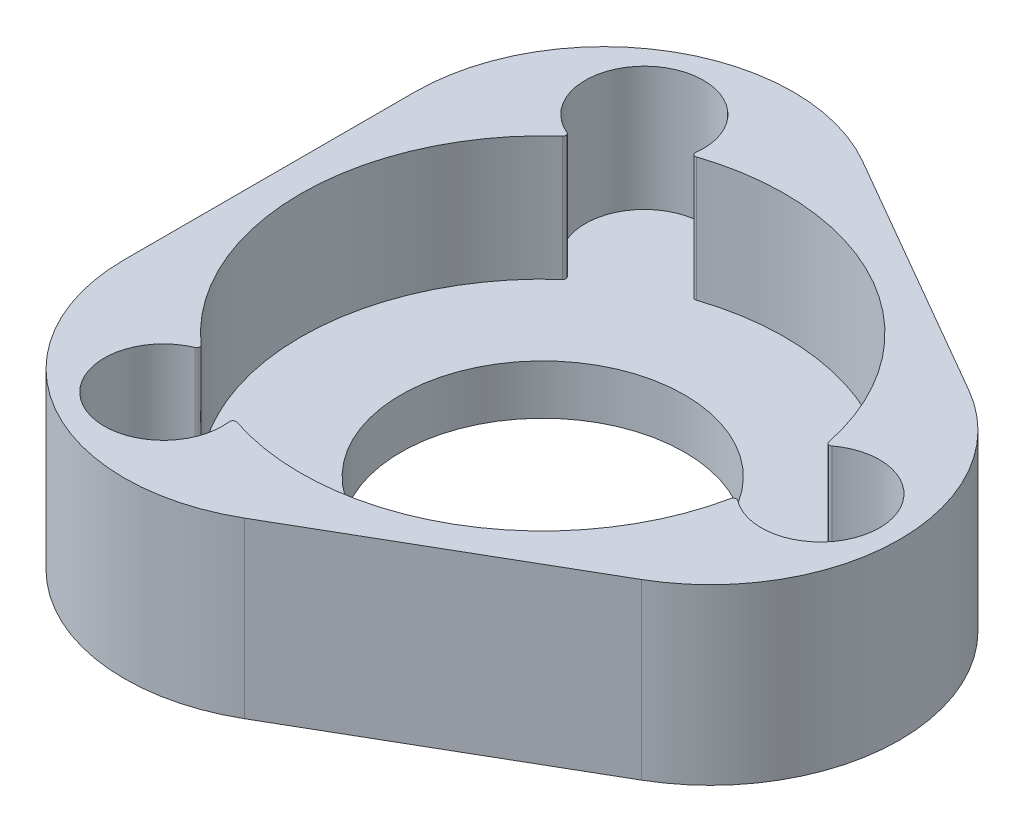
ISO-10303-21;
HEADER;
FILE_DESCRIPTION(('STEP AP214'),'2;1');
FILE_NAME('part.step','',(''),(''),'','','');
FILE_SCHEMA(('AUTOMOTIVE_DESIGN { 1 0 10303 214 1 1 1 1 }'));
ENDSEC;
DATA;
#1=APPLICATION_CONTEXT('core data for automotive mechanical design processes');
#2=APPLICATION_PROTOCOL_DEFINITION('international standard','automotive_design',2000,#1);
#3=PRODUCT_CONTEXT('',#1,'mechanical');
#4=PRODUCT('Part','Part','',(#3));
#5=PRODUCT_RELATED_PRODUCT_CATEGORY('part','',(#4));
#6=PRODUCT_DEFINITION_FORMATION('','',#4);
#7=PRODUCT_DEFINITION_CONTEXT('part definition',#1,'design');
#8=PRODUCT_DEFINITION('design','',#6,#7);
#9=PRODUCT_DEFINITION_SHAPE('','',#8);
#10=(LENGTH_UNIT() NAMED_UNIT(*) SI_UNIT(.MILLI.,.METRE.));
#11=(NAMED_UNIT(*) PLANE_ANGLE_UNIT() SI_UNIT($,.RADIAN.));
#12=(NAMED_UNIT(*) SI_UNIT($,.STERADIAN.) SOLID_ANGLE_UNIT());
#13=UNCERTAINTY_MEASURE_WITH_UNIT(LENGTH_MEASURE(1.E-05),#10,'distance_accuracy_value','');
#14=(GEOMETRIC_REPRESENTATION_CONTEXT(3) GLOBAL_UNCERTAINTY_ASSIGNED_CONTEXT((#13)) GLOBAL_UNIT_ASSIGNED_CONTEXT((#10,
#11,#12)) REPRESENTATION_CONTEXT('',''));
#15=CARTESIAN_POINT('',(0.,0.,0.));
#16=DIRECTION('',(0.,0.,1.));
#17=DIRECTION('',(1.,0.,0.));
#18=AXIS2_PLACEMENT_3D('',#15,#16,#17);
#19=CARTESIAN_POINT('',(-3.38,7.,-5.85433172958281));
#20=DIRECTION('',(0.,1.,0.));
#21=DIRECTION('',(0.,0.,1.));
#22=AXIS2_PLACEMENT_3D('',#19,#20,#21);
#23=PLANE('',#22);
#24=CARTESIAN_POINT('',(-3.38,7.,-5.85433172958281));
#25=DIRECTION('',(0.,1.,0.));
#26=DIRECTION('',(0.,0.,1.));
#27=AXIS2_PLACEMENT_3D('',#24,#25,#26);
#28=CIRCLE('',#27,7.62);
#29=CARTESIAN_POINT('',(0.43,7.,-12.4534453064202));
#30=VERTEX_POINT('',#29);
#31=CARTESIAN_POINT('',(-11.,7.,-5.85433172958281));
#32=VERTEX_POINT('',#31);
#33=EDGE_CURVE('E152',#30,#32,#28,.T.);
#34=ORIENTED_EDGE('',*,*,#33,.T.);
#35=DIRECTION('',(0.,0.,1.));
#36=VECTOR('',#35,1.);
#37=CARTESIAN_POINT('',(-11.,7.,-5.85433172958281));
#38=LINE('',#37,#36);
#39=CARTESIAN_POINT('',(-11.,7.,5.85433172958281));
#40=VERTEX_POINT('',#39);
#41=EDGE_CURVE('E102',#32,#40,#38,.T.);
#42=ORIENTED_EDGE('',*,*,#41,.T.);
#43=CARTESIAN_POINT('',(-3.38,7.,5.85433172958281));
#44=DIRECTION('',(0.,1.,0.));
#45=DIRECTION('',(0.,0.,-1.));
#46=AXIS2_PLACEMENT_3D('',#43,#44,#45);
#47=CIRCLE('',#46,7.62);
#48=CARTESIAN_POINT('',(0.429999999999999,7.,12.4534453064202));
#49=VERTEX_POINT('',#48);
#50=EDGE_CURVE('E119',#40,#49,#47,.T.);
#51=ORIENTED_EDGE('',*,*,#50,.T.);
#52=DIRECTION('',(0.866025403784438,0.,-0.5));
#53=VECTOR('',#52,1.);
#54=CARTESIAN_POINT('',(0.429999999999999,7.,12.4534453064202));
#55=LINE('',#54,#53);
#56=CARTESIAN_POINT('',(10.57,7.,6.59911357683742));
#57=VERTEX_POINT('',#56);
#58=EDGE_CURVE('E112',#49,#57,#55,.T.);
#59=ORIENTED_EDGE('',*,*,#58,.T.);
#60=CARTESIAN_POINT('',(6.76,7.,0.));
#61=DIRECTION('',(0.,1.,0.));
#62=DIRECTION('',(0.,0.,1.));
#63=AXIS2_PLACEMENT_3D('',#60,#61,#62);
#64=CIRCLE('',#63,7.62);
#65=CARTESIAN_POINT('',(10.57,7.,-6.59911357683742));
#66=VERTEX_POINT('',#65);
#67=EDGE_CURVE('E116',#57,#66,#64,.T.);
#68=ORIENTED_EDGE('',*,*,#67,.T.);
#69=DIRECTION('',(-0.866025403784438,0.,-0.5));
#70=VECTOR('',#69,1.);
#71=CARTESIAN_POINT('',(10.57,7.,-6.59911357683742));
#72=LINE('',#71,#70);
#73=EDGE_CURVE('E67',#66,#30,#72,.T.);
#74=ORIENTED_EDGE('',*,*,#73,.T.);
#75=EDGE_LOOP('',(#34,#42,#51,#59,#68,#74));
#76=FACE_BOUND('',#75,.T.);
#77=CARTESIAN_POINT('',(-5.59427831880803,7.,9.68957427985663));
#78=DIRECTION('',(0.,1.,0.));
#79=DIRECTION('',(0.,0.,1.));
#80=AXIS2_PLACEMENT_3D('',#77,#78,#79);
#81=CIRCLE('',#80,2.38125);
#82=CARTESIAN_POINT('',(-6.51776577997234,7.,7.49468875400971));
#83=VERTEX_POINT('',#82);
#84=CARTESIAN_POINT('',(-3.23170796444369,7.,9.39189511837782));
#85=VERTEX_POINT('',#84);
#86=EDGE_CURVE('E203',#83,#85,#81,.T.);
#87=ORIENTED_EDGE('',*,*,#86,.F.);
#88=CARTESIAN_POINT('',(-6.56701844456777,7.,7.3776281926312));
#89=DIRECTION('',(0.,1.,0.));
#90=DIRECTION('',(0.,0.,1.));
#91=AXIS2_PLACEMENT_3D('',#88,#89,#90);
#92=CIRCLE('',#91,0.127);
#93=CARTESIAN_POINT('',(-6.4825787014818,7.,7.28276550350858));
#94=VERTEX_POINT('',#93);
#95=EDGE_CURVE('E58',#83,#94,#92,.T.);
#96=ORIENTED_EDGE('',*,*,#95,.T.);
#97=CARTESIAN_POINT('',(0.,7.,0.));
#98=DIRECTION('',(0.,1.,0.));
#99=DIRECTION('',(0.,0.,1.));
#100=AXIS2_PLACEMENT_3D('',#97,#98,#99);
#101=CIRCLE('',#100,9.75);
#102=CARTESIAN_POINT('',(-6.48257870148184,7.,-7.28276550350855));
#103=VERTEX_POINT('',#102);
#104=EDGE_CURVE('E234',#103,#94,#101,.T.);
#105=ORIENTED_EDGE('',*,*,#104,.F.);
#106=CARTESIAN_POINT('',(-6.5670184445678,7.,-7.37762819263117));
#107=DIRECTION('',(0.,-1.,0.));
#108=DIRECTION('',(0.,0.,-1.));
#109=AXIS2_PLACEMENT_3D('',#106,#107,#108);
#110=CIRCLE('',#109,0.126999999999999);
#111=CARTESIAN_POINT('',(-6.51776577997238,7.,-7.49468875400967));
#112=VERTEX_POINT('',#111);
#113=EDGE_CURVE('E231',#112,#103,#110,.T.);
#114=ORIENTED_EDGE('',*,*,#113,.F.);
#115=CARTESIAN_POINT('',(-5.59427831880808,7.,-9.6895742798566));
#116=DIRECTION('',(0.,1.,0.));
#117=DIRECTION('',(0.,0.,1.));
#118=AXIS2_PLACEMENT_3D('',#115,#116,#117);
#119=CIRCLE('',#118,2.38125);
#120=CARTESIAN_POINT('',(-3.23170796444373,7.,-9.39189511837781));
#121=VERTEX_POINT('',#120);
#122=EDGE_CURVE('E228',#121,#112,#119,.T.);
#123=ORIENTED_EDGE('',*,*,#122,.F.);
#124=CARTESIAN_POINT('',(-3.10570421221097,7.,-9.37601889643227));
#125=DIRECTION('',(0.,1.,0.));
#126=DIRECTION('',(0.,0.,1.));
#127=AXIS2_PLACEMENT_3D('',#124,#125,#126);
#128=CIRCLE('',#127,0.127);
#129=CARTESIAN_POINT('',(-3.06577058510245,7.,-9.25546058926948));
#130=VERTEX_POINT('',#129);
#131=EDGE_CURVE('E225',#121,#130,#128,.T.);
#132=ORIENTED_EDGE('',*,*,#131,.T.);
#133=CARTESIAN_POINT('',(0.,7.,0.));
#134=DIRECTION('',(0.,1.,0.));
#135=DIRECTION('',(0.,0.,1.));
#136=AXIS2_PLACEMENT_3D('',#133,#134,#135);
#137=CIRCLE('',#136,9.75);
#138=CARTESIAN_POINT('',(9.54834928658427,7.,-1.97269508576102));
#139=VERTEX_POINT('',#138);
#140=EDGE_CURVE('E222',#139,#130,#137,.T.);
#141=ORIENTED_EDGE('',*,*,#140,.F.);
#142=CARTESIAN_POINT('',(9.67272265677875,7.,-1.99839070380119));
#143=DIRECTION('',(0.,-1.,0.));
#144=DIRECTION('',(0.,0.,-1.));
#145=AXIS2_PLACEMENT_3D('',#142,#143,#144);
#146=CIRCLE('',#145,0.126999999999999);
#147=CARTESIAN_POINT('',(9.74947374441609,7.,-1.89720636436823));
#148=VERTEX_POINT('',#147);
#149=EDGE_CURVE('E219',#148,#139,#146,.T.);
#150=ORIENTED_EDGE('',*,*,#149,.F.);
#151=CARTESIAN_POINT('',(11.1885566376162,7.,-1.05818132034585E-13));
#152=DIRECTION('',(0.,1.,0.));
#153=DIRECTION('',(0.,0.,1.));
#154=AXIS2_PLACEMENT_3D('',#151,#152,#153);
#155=CIRCLE('',#154,2.38125);
#156=CARTESIAN_POINT('',(9.74947374441612,7.,1.89720636436804));
#157=VERTEX_POINT('',#156);
#158=EDGE_CURVE('E216',#157,#148,#155,.T.);
#159=ORIENTED_EDGE('',*,*,#158,.F.);
#160=CARTESIAN_POINT('',(9.67272265677879,7.,1.99839070380101));
#161=DIRECTION('',(0.,1.,0.));
#162=DIRECTION('',(0.,0.,1.));
#163=AXIS2_PLACEMENT_3D('',#160,#161,#162);
#164=CIRCLE('',#163,0.127);
#165=CARTESIAN_POINT('',(9.5483492865843,7.,1.97269508576084));
#166=VERTEX_POINT('',#165);
#167=EDGE_CURVE('E213',#157,#166,#164,.T.);
#168=ORIENTED_EDGE('',*,*,#167,.T.);
#169=CARTESIAN_POINT('',(0.,7.,0.));
#170=DIRECTION('',(0.,1.,0.));
#171=DIRECTION('',(0.,0.,1.));
#172=AXIS2_PLACEMENT_3D('',#169,#170,#171);
#173=CIRCLE('',#172,9.75);
#174=CARTESIAN_POINT('',(-3.06577058510241,7.,9.25546058926949));
#175=VERTEX_POINT('',#174);
#176=EDGE_CURVE('E210',#175,#166,#173,.T.);
#177=ORIENTED_EDGE('',*,*,#176,.F.);
#178=CARTESIAN_POINT('',(-3.10570421221092,7.,9.37601889643229));
#179=DIRECTION('',(0.,-1.,0.));
#180=DIRECTION('',(0.,0.,-1.));
#181=AXIS2_PLACEMENT_3D('',#178,#179,#180);
#182=CIRCLE('',#181,0.127);
#183=EDGE_CURVE('E207',#85,#175,#182,.T.);
#184=ORIENTED_EDGE('',*,*,#183,.F.);
#185=EDGE_LOOP('',(#87,#96,#105,#114,#123,#132,#141,#150,#159,#168,#177,#184));
#186=FACE_BOUND('',#185,.T.);
#187=ADVANCED_FACE('F43',(#76,#186),#23,.T.);
#188=CARTESIAN_POINT('',(-3.38,7.,-5.85433172958281));
#189=DIRECTION('',(0.,-1.,0.));
#190=DIRECTION('',(0.,0.,-1.));
#191=AXIS2_PLACEMENT_3D('',#188,#189,#190);
#192=CYLINDRICAL_SURFACE('',#191,7.62);
#193=CARTESIAN_POINT('',(-3.38,0.,-5.85433172958281));
#194=DIRECTION('',(0.,1.,0.));
#195=DIRECTION('',(0.,0.,1.));
#196=AXIS2_PLACEMENT_3D('',#193,#194,#195);
#197=CIRCLE('',#196,7.62);
#198=CARTESIAN_POINT('',(0.43,0.,-12.4534453064202));
#199=VERTEX_POINT('',#198);
#200=CARTESIAN_POINT('',(-11.,0.,-5.85433172958281));
#201=VERTEX_POINT('',#200);
#202=EDGE_CURVE('E140',#199,#201,#197,.T.);
#203=ORIENTED_EDGE('',*,*,#202,.T.);
#204=DIRECTION('',(0.,-1.,0.));
#205=VECTOR('',#204,1.);
#206=CARTESIAN_POINT('',(-11.,7.,-5.85433172958281));
#207=LINE('',#206,#205);
#208=EDGE_CURVE('E11',#32,#201,#207,.T.);
#209=ORIENTED_EDGE('',*,*,#208,.F.);
#210=ORIENTED_EDGE('',*,*,#33,.F.);
#211=DIRECTION('',(0.,-1.,0.));
#212=VECTOR('',#211,1.);
#213=CARTESIAN_POINT('',(0.43,7.,-12.4534453064202));
#214=LINE('',#213,#212);
#215=EDGE_CURVE('E136',#30,#199,#214,.T.);
#216=ORIENTED_EDGE('',*,*,#215,.T.);
#217=EDGE_LOOP('',(#203,#209,#210,#216));
#218=FACE_BOUND('',#217,.T.);
#219=ADVANCED_FACE('F45',(#218),#192,.T.);
#220=CARTESIAN_POINT('',(-11.,7.,-5.85433172958281));
#221=DIRECTION('',(1.,0.,0.));
#222=DIRECTION('',(0.,0.,-1.));
#223=AXIS2_PLACEMENT_3D('',#220,#221,#222);
#224=PLANE('',#223);
#225=DIRECTION('',(0.,0.,1.));
#226=VECTOR('',#225,1.);
#227=CARTESIAN_POINT('',(-11.,0.,-5.85433172958281));
#228=LINE('',#227,#226);
#229=CARTESIAN_POINT('',(-11.,0.,5.85433172958281));
#230=VERTEX_POINT('',#229);
#231=EDGE_CURVE('E143',#201,#230,#228,.T.);
#232=ORIENTED_EDGE('',*,*,#231,.T.);
#233=DIRECTION('',(0.,-1.,0.));
#234=VECTOR('',#233,1.);
#235=CARTESIAN_POINT('',(-11.,7.,5.85433172958281));
#236=LINE('',#235,#234);
#237=EDGE_CURVE('E51',#40,#230,#236,.T.);
#238=ORIENTED_EDGE('',*,*,#237,.F.);
#239=ORIENTED_EDGE('',*,*,#41,.F.);
#240=ORIENTED_EDGE('',*,*,#208,.T.);
#241=EDGE_LOOP('',(#232,#238,#239,#240));
#242=FACE_BOUND('',#241,.T.);
#243=ADVANCED_FACE('F398',(#242),#224,.F.);
#244=CARTESIAN_POINT('',(-3.38,7.,5.85433172958281));
#245=DIRECTION('',(0.,-1.,0.));
#246=DIRECTION('',(0.,0.,-1.));
#247=AXIS2_PLACEMENT_3D('',#244,#245,#246);
#248=CYLINDRICAL_SURFACE('',#247,7.62);
#249=CARTESIAN_POINT('',(-3.38,0.,5.85433172958281));
#250=DIRECTION('',(0.,1.,0.));
#251=DIRECTION('',(0.,0.,-1.));
#252=AXIS2_PLACEMENT_3D('',#249,#250,#251);
#253=CIRCLE('',#252,7.62);
#254=CARTESIAN_POINT('',(0.429999999999999,0.,12.4534453064202));
#255=VERTEX_POINT('',#254);
#256=EDGE_CURVE('E146',#230,#255,#253,.T.);
#257=ORIENTED_EDGE('',*,*,#256,.T.);
#258=DIRECTION('',(0.,-1.,0.));
#259=VECTOR('',#258,1.);
#260=CARTESIAN_POINT('',(0.429999999999999,7.,12.4534453064202));
#261=LINE('',#260,#259);
#262=EDGE_CURVE('E131',#49,#255,#261,.T.);
#263=ORIENTED_EDGE('',*,*,#262,.F.);
#264=ORIENTED_EDGE('',*,*,#50,.F.);
#265=ORIENTED_EDGE('',*,*,#237,.T.);
#266=EDGE_LOOP('',(#257,#263,#264,#265));
#267=FACE_BOUND('',#266,.T.);
#268=ADVANCED_FACE('F158',(#267),#248,.T.);
#269=CARTESIAN_POINT('',(0.429999999999999,7.,12.4534453064202));
#270=DIRECTION('',(-0.5,0.,-0.866025403784438));
#271=DIRECTION('',(-0.866025403784439,0.,0.5));
#272=AXIS2_PLACEMENT_3D('',#269,#270,#271);
#273=PLANE('',#272);
#274=DIRECTION('',(0.866025403784438,0.,-0.5));
#275=VECTOR('',#274,1.);
#276=CARTESIAN_POINT('',(0.429999999999999,0.,12.4534453064202));
#277=LINE('',#276,#275);
#278=CARTESIAN_POINT('',(10.57,0.,6.59911357683742));
#279=VERTEX_POINT('',#278);
#280=EDGE_CURVE('E128',#255,#279,#277,.T.);
#281=ORIENTED_EDGE('',*,*,#280,.T.);
#282=DIRECTION('',(0.,-1.,0.));
#283=VECTOR('',#282,1.);
#284=CARTESIAN_POINT('',(10.57,7.,6.59911357683742));
#285=LINE('',#284,#283);
#286=EDGE_CURVE('E125',#57,#279,#285,.T.);
#287=ORIENTED_EDGE('',*,*,#286,.F.);
#288=ORIENTED_EDGE('',*,*,#58,.F.);
#289=ORIENTED_EDGE('',*,*,#262,.T.);
#290=EDGE_LOOP('',(#281,#287,#288,#289));
#291=FACE_BOUND('',#290,.T.);
#292=ADVANCED_FACE('F126',(#291),#273,.F.);
#293=CARTESIAN_POINT('',(6.76,7.,0.));
#294=DIRECTION('',(0.,-1.,0.));
#295=DIRECTION('',(0.,0.,-1.));
#296=AXIS2_PLACEMENT_3D('',#293,#294,#295);
#297=CYLINDRICAL_SURFACE('',#296,7.62);
#298=CARTESIAN_POINT('',(6.76,0.,0.));
#299=DIRECTION('',(0.,1.,0.));
#300=DIRECTION('',(0.,0.,1.));
#301=AXIS2_PLACEMENT_3D('',#298,#299,#300);
#302=CIRCLE('',#301,7.62);
#303=CARTESIAN_POINT('',(10.57,0.,-6.59911357683742));
#304=VERTEX_POINT('',#303);
#305=EDGE_CURVE('E149',#279,#304,#302,.T.);
#306=ORIENTED_EDGE('',*,*,#305,.T.);
#307=DIRECTION('',(0.,-1.,0.));
#308=VECTOR('',#307,1.);
#309=CARTESIAN_POINT('',(10.57,7.,-6.59911357683742));
#310=LINE('',#309,#308);
#311=EDGE_CURVE('E132',#66,#304,#310,.T.);
#312=ORIENTED_EDGE('',*,*,#311,.F.);
#313=ORIENTED_EDGE('',*,*,#67,.F.);
#314=ORIENTED_EDGE('',*,*,#286,.T.);
#315=EDGE_LOOP('',(#306,#312,#313,#314));
#316=FACE_BOUND('',#315,.T.);
#317=ADVANCED_FACE('F134',(#316),#297,.T.);
#318=CARTESIAN_POINT('',(10.57,7.,-6.59911357683742));
#319=DIRECTION('',(-0.5,0.,0.866025403784438));
#320=DIRECTION('',(0.866025403784439,0.,0.5));
#321=AXIS2_PLACEMENT_3D('',#318,#319,#320);
#322=PLANE('',#321);
#323=DIRECTION('',(-0.866025403784438,0.,-0.5));
#324=VECTOR('',#323,1.);
#325=CARTESIAN_POINT('',(10.57,0.,-6.59911357683742));
#326=LINE('',#325,#324);
#327=EDGE_CURVE('E94',#304,#199,#326,.T.);
#328=ORIENTED_EDGE('',*,*,#327,.T.);
#329=ORIENTED_EDGE('',*,*,#215,.F.);
#330=ORIENTED_EDGE('',*,*,#73,.F.);
#331=ORIENTED_EDGE('',*,*,#311,.T.);
#332=EDGE_LOOP('',(#328,#329,#330,#331));
#333=FACE_BOUND('',#332,.T.);
#334=ADVANCED_FACE('F162',(#333),#322,.F.);
#335=CARTESIAN_POINT('',(-3.38,0.,-5.85433172958281));
#336=DIRECTION('',(0.,1.,0.));
#337=DIRECTION('',(0.,0.,1.));
#338=AXIS2_PLACEMENT_3D('',#335,#336,#337);
#339=PLANE('',#338);
#340=CARTESIAN_POINT('',(0.,0.,0.));
#341=DIRECTION('',(0.,1.,0.));
#342=DIRECTION('',(0.,0.,1.));
#343=AXIS2_PLACEMENT_3D('',#340,#341,#342);
#344=CIRCLE('',#343,5.715);
#345=CARTESIAN_POINT('',(0.,0.,5.715));
#346=VERTEX_POINT('',#345);
#347=EDGE_CURVE('E238',#346,#346,#344,.T.);
#348=ORIENTED_EDGE('',*,*,#347,.T.);
#349=EDGE_LOOP('',(#348));
#350=FACE_BOUND('',#349,.T.);
#351=ORIENTED_EDGE('',*,*,#202,.F.);
#352=ORIENTED_EDGE('',*,*,#327,.F.);
#353=ORIENTED_EDGE('',*,*,#305,.F.);
#354=ORIENTED_EDGE('',*,*,#280,.F.);
#355=ORIENTED_EDGE('',*,*,#256,.F.);
#356=ORIENTED_EDGE('',*,*,#231,.F.);
#357=EDGE_LOOP('',(#351,#352,#353,#354,#355,#356));
#358=FACE_BOUND('',#357,.T.);
#359=ADVANCED_FACE('F161',(#350,#358),#339,.F.);
#360=CARTESIAN_POINT('',(-6.56701844456777,2.,7.3776281926312));
#361=DIRECTION('',(0.,1.,0.));
#362=DIRECTION('',(0.,0.,1.));
#363=AXIS2_PLACEMENT_3D('',#360,#361,#362);
#364=CYLINDRICAL_SURFACE('',#363,0.127);
#365=ORIENTED_EDGE('',*,*,#95,.F.);
#366=DIRECTION('',(0.,1.,0.));
#367=VECTOR('',#366,1.);
#368=CARTESIAN_POINT('',(-6.51776577997234,2.,7.49468875400971));
#369=LINE('',#368,#367);
#370=CARTESIAN_POINT('',(-6.51776577997234,2.,7.49468875400971));
#371=VERTEX_POINT('',#370);
#372=EDGE_CURVE('E200',#371,#83,#369,.T.);
#373=ORIENTED_EDGE('',*,*,#372,.F.);
#374=CARTESIAN_POINT('',(-6.56701844456777,2.,7.3776281926312));
#375=DIRECTION('',(0.,1.,0.));
#376=DIRECTION('',(0.,0.,1.));
#377=AXIS2_PLACEMENT_3D('',#374,#375,#376);
#378=CIRCLE('',#377,0.127);
#379=CARTESIAN_POINT('',(-6.4825787014818,2.,7.28276550350858));
#380=VERTEX_POINT('',#379);
#381=EDGE_CURVE('E206',#371,#380,#378,.T.);
#382=ORIENTED_EDGE('',*,*,#381,.T.);
#383=DIRECTION('',(0.,1.,0.));
#384=VECTOR('',#383,1.);
#385=CARTESIAN_POINT('',(-6.4825787014818,2.,7.28276550350858));
#386=LINE('',#385,#384);
#387=EDGE_CURVE('E144',#380,#94,#386,.T.);
#388=ORIENTED_EDGE('',*,*,#387,.T.);
#389=EDGE_LOOP('',(#365,#373,#382,#388));
#390=FACE_BOUND('',#389,.T.);
#391=ADVANCED_FACE('F382',(#390),#364,.T.);
#392=CARTESIAN_POINT('',(0.,2.,0.));
#393=DIRECTION('',(0.,1.,0.));
#394=DIRECTION('',(0.,0.,1.));
#395=AXIS2_PLACEMENT_3D('',#392,#393,#394);
#396=CYLINDRICAL_SURFACE('',#395,9.75);
#397=ORIENTED_EDGE('',*,*,#104,.T.);
#398=ORIENTED_EDGE('',*,*,#387,.F.);
#399=CARTESIAN_POINT('',(0.,2.,0.));
#400=DIRECTION('',(0.,1.,0.));
#401=DIRECTION('',(0.,0.,1.));
#402=AXIS2_PLACEMENT_3D('',#399,#400,#401);
#403=CIRCLE('',#402,9.75);
#404=CARTESIAN_POINT('',(-6.48257870148184,2.,-7.28276550350855));
#405=VERTEX_POINT('',#404);
#406=EDGE_CURVE('E268',#405,#380,#403,.T.);
#407=ORIENTED_EDGE('',*,*,#406,.F.);
#408=DIRECTION('',(0.,1.,0.));
#409=VECTOR('',#408,1.);
#410=CARTESIAN_POINT('',(-6.48257870148184,2.,-7.28276550350855));
#411=LINE('',#410,#409);
#412=EDGE_CURVE('E170',#405,#103,#411,.T.);
#413=ORIENTED_EDGE('',*,*,#412,.T.);
#414=EDGE_LOOP('',(#397,#398,#407,#413));
#415=FACE_BOUND('',#414,.T.);
#416=ADVANCED_FACE('F381',(#415),#396,.F.);
#417=CARTESIAN_POINT('',(-6.5670184445678,2.,-7.37762819263117));
#418=DIRECTION('',(0.,1.,0.));
#419=DIRECTION('',(0.,0.,1.));
#420=AXIS2_PLACEMENT_3D('',#417,#418,#419);
#421=CYLINDRICAL_SURFACE('',#420,0.126999999999999);
#422=ORIENTED_EDGE('',*,*,#113,.T.);
#423=ORIENTED_EDGE('',*,*,#412,.F.);
#424=CARTESIAN_POINT('',(-6.5670184445678,2.,-7.37762819263117));
#425=DIRECTION('',(0.,-1.,0.));
#426=DIRECTION('',(0.,0.,-1.));
#427=AXIS2_PLACEMENT_3D('',#424,#425,#426);
#428=CIRCLE('',#427,0.126999999999999);
#429=CARTESIAN_POINT('',(-6.51776577997238,2.,-7.49468875400967));
#430=VERTEX_POINT('',#429);
#431=EDGE_CURVE('E265',#430,#405,#428,.T.);
#432=ORIENTED_EDGE('',*,*,#431,.F.);
#433=DIRECTION('',(0.,1.,0.));
#434=VECTOR('',#433,1.);
#435=CARTESIAN_POINT('',(-6.51776577997238,2.,-7.49468875400967));
#436=LINE('',#435,#434);
#437=EDGE_CURVE('E173',#430,#112,#436,.T.);
#438=ORIENTED_EDGE('',*,*,#437,.T.);
#439=EDGE_LOOP('',(#422,#423,#432,#438));
#440=FACE_BOUND('',#439,.T.);
#441=ADVANCED_FACE('F378',(#440),#421,.T.);
#442=CARTESIAN_POINT('',(-5.59427831880808,2.,-9.6895742798566));
#443=DIRECTION('',(0.,1.,0.));
#444=DIRECTION('',(0.,0.,1.));
#445=AXIS2_PLACEMENT_3D('',#442,#443,#444);
#446=CYLINDRICAL_SURFACE('',#445,2.38125);
#447=ORIENTED_EDGE('',*,*,#122,.T.);
#448=ORIENTED_EDGE('',*,*,#437,.F.);
#449=CARTESIAN_POINT('',(-5.59427831880808,2.,-9.6895742798566));
#450=DIRECTION('',(0.,1.,0.));
#451=DIRECTION('',(0.,0.,1.));
#452=AXIS2_PLACEMENT_3D('',#449,#450,#451);
#453=CIRCLE('',#452,2.38125);
#454=CARTESIAN_POINT('',(-3.23170796444373,2.,-9.39189511837781));
#455=VERTEX_POINT('',#454);
#456=EDGE_CURVE('E262',#455,#430,#453,.T.);
#457=ORIENTED_EDGE('',*,*,#456,.F.);
#458=DIRECTION('',(0.,1.,0.));
#459=VECTOR('',#458,1.);
#460=CARTESIAN_POINT('',(-3.23170796444373,2.,-9.39189511837781));
#461=LINE('',#460,#459);
#462=EDGE_CURVE('E176',#455,#121,#461,.T.);
#463=ORIENTED_EDGE('',*,*,#462,.T.);
#464=EDGE_LOOP('',(#447,#448,#457,#463));
#465=FACE_BOUND('',#464,.T.);
#466=ADVANCED_FACE('F374',(#465),#446,.F.);
#467=CARTESIAN_POINT('',(-3.10570421221097,2.,-9.37601889643227));
#468=DIRECTION('',(0.,1.,0.));
#469=DIRECTION('',(0.,0.,1.));
#470=AXIS2_PLACEMENT_3D('',#467,#468,#469);
#471=CYLINDRICAL_SURFACE('',#470,0.127);
#472=ORIENTED_EDGE('',*,*,#131,.F.);
#473=ORIENTED_EDGE('',*,*,#462,.F.);
#474=CARTESIAN_POINT('',(-3.10570421221097,2.,-9.37601889643227));
#475=DIRECTION('',(0.,1.,0.));
#476=DIRECTION('',(0.,0.,1.));
#477=AXIS2_PLACEMENT_3D('',#474,#475,#476);
#478=CIRCLE('',#477,0.127);
#479=CARTESIAN_POINT('',(-3.06577058510245,2.,-9.25546058926948));
#480=VERTEX_POINT('',#479);
#481=EDGE_CURVE('E259',#455,#480,#478,.T.);
#482=ORIENTED_EDGE('',*,*,#481,.T.);
#483=DIRECTION('',(0.,1.,0.));
#484=VECTOR('',#483,1.);
#485=CARTESIAN_POINT('',(-3.06577058510245,2.,-9.25546058926948));
#486=LINE('',#485,#484);
#487=EDGE_CURVE('E179',#480,#130,#486,.T.);
#488=ORIENTED_EDGE('',*,*,#487,.T.);
#489=EDGE_LOOP('',(#472,#473,#482,#488));
#490=FACE_BOUND('',#489,.T.);
#491=ADVANCED_FACE('F371',(#490),#471,.T.);
#492=CARTESIAN_POINT('',(0.,2.,0.));
#493=DIRECTION('',(0.,1.,0.));
#494=DIRECTION('',(0.,0.,1.));
#495=AXIS2_PLACEMENT_3D('',#492,#493,#494);
#496=CYLINDRICAL_SURFACE('',#495,9.75);
#497=ORIENTED_EDGE('',*,*,#140,.T.);
#498=ORIENTED_EDGE('',*,*,#487,.F.);
#499=CARTESIAN_POINT('',(0.,2.,0.));
#500=DIRECTION('',(0.,1.,0.));
#501=DIRECTION('',(0.,0.,1.));
#502=AXIS2_PLACEMENT_3D('',#499,#500,#501);
#503=CIRCLE('',#502,9.75);
#504=CARTESIAN_POINT('',(9.54834928658427,2.,-1.97269508576102));
#505=VERTEX_POINT('',#504);
#506=EDGE_CURVE('E256',#505,#480,#503,.T.);
#507=ORIENTED_EDGE('',*,*,#506,.F.);
#508=DIRECTION('',(0.,1.,0.));
#509=VECTOR('',#508,1.);
#510=CARTESIAN_POINT('',(9.54834928658427,2.,-1.97269508576102));
#511=LINE('',#510,#509);
#512=EDGE_CURVE('E182',#505,#139,#511,.T.);
#513=ORIENTED_EDGE('',*,*,#512,.T.);
#514=EDGE_LOOP('',(#497,#498,#507,#513));
#515=FACE_BOUND('',#514,.T.);
#516=ADVANCED_FACE('F367',(#515),#496,.F.);
#517=CARTESIAN_POINT('',(9.67272265677875,2.,-1.99839070380119));
#518=DIRECTION('',(0.,1.,0.));
#519=DIRECTION('',(0.,0.,1.));
#520=AXIS2_PLACEMENT_3D('',#517,#518,#519);
#521=CYLINDRICAL_SURFACE('',#520,0.126999999999999);
#522=ORIENTED_EDGE('',*,*,#149,.T.);
#523=ORIENTED_EDGE('',*,*,#512,.F.);
#524=CARTESIAN_POINT('',(9.67272265677875,2.,-1.99839070380119));
#525=DIRECTION('',(0.,-1.,0.));
#526=DIRECTION('',(0.,0.,-1.));
#527=AXIS2_PLACEMENT_3D('',#524,#525,#526);
#528=CIRCLE('',#527,0.126999999999999);
#529=CARTESIAN_POINT('',(9.74947374441609,2.,-1.89720636436823));
#530=VERTEX_POINT('',#529);
#531=EDGE_CURVE('E253',#530,#505,#528,.T.);
#532=ORIENTED_EDGE('',*,*,#531,.F.);
#533=DIRECTION('',(0.,1.,0.));
#534=VECTOR('',#533,1.);
#535=CARTESIAN_POINT('',(9.74947374441609,2.,-1.89720636436823));
#536=LINE('',#535,#534);
#537=EDGE_CURVE('E185',#530,#148,#536,.T.);
#538=ORIENTED_EDGE('',*,*,#537,.T.);
#539=EDGE_LOOP('',(#522,#523,#532,#538));
#540=FACE_BOUND('',#539,.T.);
#541=ADVANCED_FACE('F361',(#540),#521,.T.);
#542=CARTESIAN_POINT('',(11.1885566376162,2.,-1.05818132034585E-13));
#543=DIRECTION('',(0.,1.,0.));
#544=DIRECTION('',(0.,0.,1.));
#545=AXIS2_PLACEMENT_3D('',#542,#543,#544);
#546=CYLINDRICAL_SURFACE('',#545,2.38125);
#547=ORIENTED_EDGE('',*,*,#158,.T.);
#548=ORIENTED_EDGE('',*,*,#537,.F.);
#549=CARTESIAN_POINT('',(11.1885566376162,2.,-1.05818132034585E-13));
#550=DIRECTION('',(0.,1.,0.));
#551=DIRECTION('',(0.,0.,1.));
#552=AXIS2_PLACEMENT_3D('',#549,#550,#551);
#553=CIRCLE('',#552,2.38125);
#554=CARTESIAN_POINT('',(9.74947374441612,2.,1.89720636436804));
#555=VERTEX_POINT('',#554);
#556=EDGE_CURVE('E250',#555,#530,#553,.T.);
#557=ORIENTED_EDGE('',*,*,#556,.F.);
#558=DIRECTION('',(0.,1.,0.));
#559=VECTOR('',#558,1.);
#560=CARTESIAN_POINT('',(9.74947374441612,2.,1.89720636436804));
#561=LINE('',#560,#559);
#562=EDGE_CURVE('E188',#555,#157,#561,.T.);
#563=ORIENTED_EDGE('',*,*,#562,.T.);
#564=EDGE_LOOP('',(#547,#548,#557,#563));
#565=FACE_BOUND('',#564,.T.);
#566=ADVANCED_FACE('F357',(#565),#546,.F.);
#567=CARTESIAN_POINT('',(9.67272265677879,2.,1.99839070380101));
#568=DIRECTION('',(0.,1.,0.));
#569=DIRECTION('',(0.,0.,1.));
#570=AXIS2_PLACEMENT_3D('',#567,#568,#569);
#571=CYLINDRICAL_SURFACE('',#570,0.127);
#572=ORIENTED_EDGE('',*,*,#167,.F.);
#573=ORIENTED_EDGE('',*,*,#562,.F.);
#574=CARTESIAN_POINT('',(9.67272265677879,2.,1.99839070380101));
#575=DIRECTION('',(0.,1.,0.));
#576=DIRECTION('',(0.,0.,1.));
#577=AXIS2_PLACEMENT_3D('',#574,#575,#576);
#578=CIRCLE('',#577,0.127);
#579=CARTESIAN_POINT('',(9.5483492865843,2.,1.97269508576084));
#580=VERTEX_POINT('',#579);
#581=EDGE_CURVE('E247',#555,#580,#578,.T.);
#582=ORIENTED_EDGE('',*,*,#581,.T.);
#583=DIRECTION('',(0.,1.,0.));
#584=VECTOR('',#583,1.);
#585=CARTESIAN_POINT('',(9.5483492865843,2.,1.97269508576084));
#586=LINE('',#585,#584);
#587=EDGE_CURVE('E191',#580,#166,#586,.T.);
#588=ORIENTED_EDGE('',*,*,#587,.T.);
#589=EDGE_LOOP('',(#572,#573,#582,#588));
#590=FACE_BOUND('',#589,.T.);
#591=ADVANCED_FACE('F352',(#590),#571,.T.);
#592=CARTESIAN_POINT('',(0.,2.,0.));
#593=DIRECTION('',(0.,1.,0.));
#594=DIRECTION('',(0.,0.,1.));
#595=AXIS2_PLACEMENT_3D('',#592,#593,#594);
#596=CYLINDRICAL_SURFACE('',#595,9.75);
#597=ORIENTED_EDGE('',*,*,#176,.T.);
#598=ORIENTED_EDGE('',*,*,#587,.F.);
#599=CARTESIAN_POINT('',(0.,2.,0.));
#600=DIRECTION('',(0.,1.,0.));
#601=DIRECTION('',(0.,0.,1.));
#602=AXIS2_PLACEMENT_3D('',#599,#600,#601);
#603=CIRCLE('',#602,9.75);
#604=CARTESIAN_POINT('',(-3.06577058510241,2.,9.25546058926949));
#605=VERTEX_POINT('',#604);
#606=EDGE_CURVE('E244',#605,#580,#603,.T.);
#607=ORIENTED_EDGE('',*,*,#606,.F.);
#608=DIRECTION('',(0.,1.,0.));
#609=VECTOR('',#608,1.);
#610=CARTESIAN_POINT('',(-3.06577058510241,2.,9.25546058926949));
#611=LINE('',#610,#609);
#612=EDGE_CURVE('E194',#605,#175,#611,.T.);
#613=ORIENTED_EDGE('',*,*,#612,.T.);
#614=EDGE_LOOP('',(#597,#598,#607,#613));
#615=FACE_BOUND('',#614,.T.);
#616=ADVANCED_FACE('F510',(#615),#596,.F.);
#617=CARTESIAN_POINT('',(-3.10570421221092,2.,9.37601889643229));
#618=DIRECTION('',(0.,1.,0.));
#619=DIRECTION('',(0.,0.,1.));
#620=AXIS2_PLACEMENT_3D('',#617,#618,#619);
#621=CYLINDRICAL_SURFACE('',#620,0.127);
#622=ORIENTED_EDGE('',*,*,#183,.T.);
#623=ORIENTED_EDGE('',*,*,#612,.F.);
#624=CARTESIAN_POINT('',(-3.10570421221092,2.,9.37601889643229));
#625=DIRECTION('',(0.,-1.,0.));
#626=DIRECTION('',(0.,0.,-1.));
#627=AXIS2_PLACEMENT_3D('',#624,#625,#626);
#628=CIRCLE('',#627,0.127);
#629=CARTESIAN_POINT('',(-3.23170796444369,2.,9.39189511837782));
#630=VERTEX_POINT('',#629);
#631=EDGE_CURVE('E241',#630,#605,#628,.T.);
#632=ORIENTED_EDGE('',*,*,#631,.F.);
#633=DIRECTION('',(0.,1.,0.));
#634=VECTOR('',#633,1.);
#635=CARTESIAN_POINT('',(-3.23170796444369,2.,9.39189511837782));
#636=LINE('',#635,#634);
#637=EDGE_CURVE('E197',#630,#85,#636,.T.);
#638=ORIENTED_EDGE('',*,*,#637,.T.);
#639=EDGE_LOOP('',(#622,#623,#632,#638));
#640=FACE_BOUND('',#639,.T.);
#641=ADVANCED_FACE('F303',(#640),#621,.T.);
#642=CARTESIAN_POINT('',(-5.59427831880803,2.,9.68957427985663));
#643=DIRECTION('',(0.,1.,0.));
#644=DIRECTION('',(0.,0.,1.));
#645=AXIS2_PLACEMENT_3D('',#642,#643,#644);
#646=CYLINDRICAL_SURFACE('',#645,2.38125);
#647=ORIENTED_EDGE('',*,*,#86,.T.);
#648=ORIENTED_EDGE('',*,*,#637,.F.);
#649=CARTESIAN_POINT('',(-5.59427831880803,2.,9.68957427985663));
#650=DIRECTION('',(0.,1.,0.));
#651=DIRECTION('',(0.,0.,1.));
#652=AXIS2_PLACEMENT_3D('',#649,#650,#651);
#653=CIRCLE('',#652,2.38125);
#654=EDGE_CURVE('E202',#371,#630,#653,.T.);
#655=ORIENTED_EDGE('',*,*,#654,.F.);
#656=ORIENTED_EDGE('',*,*,#372,.T.);
#657=EDGE_LOOP('',(#647,#648,#655,#656));
#658=FACE_BOUND('',#657,.T.);
#659=ADVANCED_FACE('F285',(#658),#646,.F.);
#660=CARTESIAN_POINT('',(-3.28350922228388,2.,3.6888140963156));
#661=DIRECTION('',(0.,1.,0.));
#662=DIRECTION('',(0.,0.,1.));
#663=AXIS2_PLACEMENT_3D('',#660,#661,#662);
#664=PLANE('',#663);
#665=CARTESIAN_POINT('',(0.,2.,0.));
#666=DIRECTION('',(0.,1.,0.));
#667=DIRECTION('',(0.,0.,1.));
#668=AXIS2_PLACEMENT_3D('',#665,#666,#667);
#669=CIRCLE('',#668,5.715);
#670=CARTESIAN_POINT('',(0.,2.,5.715));
#671=VERTEX_POINT('',#670);
#672=EDGE_CURVE('E275',#671,#671,#669,.T.);
#673=ORIENTED_EDGE('',*,*,#672,.F.);
#674=EDGE_LOOP('',(#673));
#675=FACE_BOUND('',#674,.T.);
#676=ORIENTED_EDGE('',*,*,#381,.F.);
#677=ORIENTED_EDGE('',*,*,#654,.T.);
#678=ORIENTED_EDGE('',*,*,#631,.T.);
#679=ORIENTED_EDGE('',*,*,#606,.T.);
#680=ORIENTED_EDGE('',*,*,#581,.F.);
#681=ORIENTED_EDGE('',*,*,#556,.T.);
#682=ORIENTED_EDGE('',*,*,#531,.T.);
#683=ORIENTED_EDGE('',*,*,#506,.T.);
#684=ORIENTED_EDGE('',*,*,#481,.F.);
#685=ORIENTED_EDGE('',*,*,#456,.T.);
#686=ORIENTED_EDGE('',*,*,#431,.T.);
#687=ORIENTED_EDGE('',*,*,#406,.T.);
#688=EDGE_LOOP('',(#676,#677,#678,#679,#680,#681,#682,#683,#684,#685,#686,#687));
#689=FACE_BOUND('',#688,.T.);
#690=ADVANCED_FACE('F282',(#675,#689),#664,.T.);
#691=CARTESIAN_POINT('',(0.,-3.,0.));
#692=DIRECTION('',(0.,1.,0.));
#693=DIRECTION('',(0.,0.,1.));
#694=AXIS2_PLACEMENT_3D('',#691,#692,#693);
#695=CYLINDRICAL_SURFACE('',#694,5.715);
#696=ORIENTED_EDGE('',*,*,#672,.T.);
#697=EDGE_LOOP('',(#696));
#698=FACE_BOUND('',#697,.T.);
#699=ORIENTED_EDGE('',*,*,#347,.F.);
#700=EDGE_LOOP('',(#699));
#701=FACE_BOUND('',#700,.T.);
#702=ADVANCED_FACE('F279',(#698,#701),#695,.F.);
#703=CLOSED_SHELL('',(#187,#219,#243,#268,#292,#317,#334,#359,#391,#416,#441,#466,#491,#516,
#541,#566,#591,#616,#641,#659,#690,#702));
#704=MANIFOLD_SOLID_BREP('B2',#703);
#705=ADVANCED_BREP_SHAPE_REPRESENTATION('',(#18,#704),#14);
#706=SHAPE_DEFINITION_REPRESENTATION(#9,#705);
ENDSEC;
END-ISO-10303-21;
